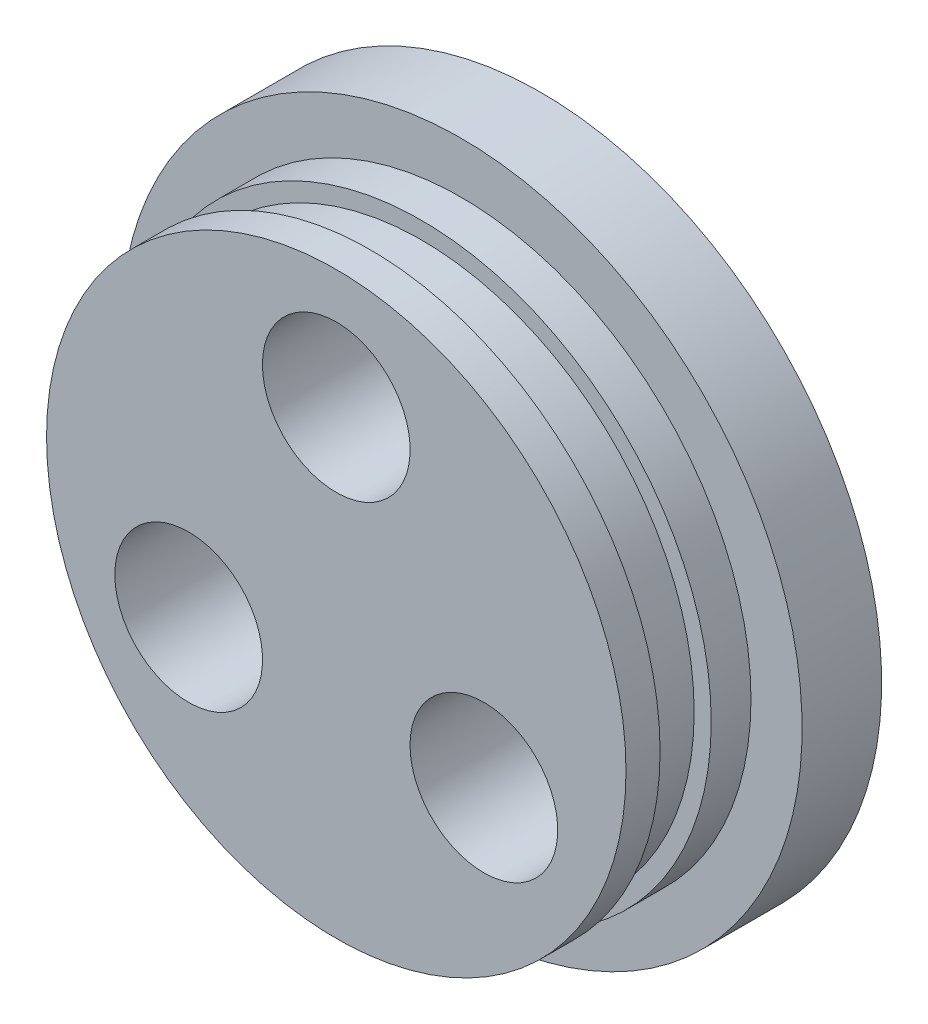
ISO-10303-21;
HEADER;
FILE_DESCRIPTION(('STEP AP214'),'2;1');
FILE_NAME('part.step','',(''),(''),'','','');
FILE_SCHEMA(('AUTOMOTIVE_DESIGN { 1 0 10303 214 1 1 1 1 }'));
ENDSEC;
DATA;
#1=APPLICATION_CONTEXT('core data for automotive mechanical design processes');
#2=APPLICATION_PROTOCOL_DEFINITION('international standard','automotive_design',2000,#1);
#3=PRODUCT_CONTEXT('',#1,'mechanical');
#4=PRODUCT('Part','Part','',(#3));
#5=PRODUCT_RELATED_PRODUCT_CATEGORY('part','',(#4));
#6=PRODUCT_DEFINITION_FORMATION('','',#4);
#7=PRODUCT_DEFINITION_CONTEXT('part definition',#1,'design');
#8=PRODUCT_DEFINITION('design','',#6,#7);
#9=PRODUCT_DEFINITION_SHAPE('','',#8);
#10=(LENGTH_UNIT() NAMED_UNIT(*) SI_UNIT(.MILLI.,.METRE.));
#11=(NAMED_UNIT(*) PLANE_ANGLE_UNIT() SI_UNIT($,.RADIAN.));
#12=(NAMED_UNIT(*) SI_UNIT($,.STERADIAN.) SOLID_ANGLE_UNIT());
#13=UNCERTAINTY_MEASURE_WITH_UNIT(LENGTH_MEASURE(1.E-05),#10,'distance_accuracy_value','');
#14=(GEOMETRIC_REPRESENTATION_CONTEXT(3) GLOBAL_UNCERTAINTY_ASSIGNED_CONTEXT((#13)) GLOBAL_UNIT_ASSIGNED_CONTEXT((#10,
#11,#12)) REPRESENTATION_CONTEXT('',''));
#15=CARTESIAN_POINT('',(0.,0.,0.));
#16=DIRECTION('',(0.,0.,1.));
#17=DIRECTION('',(1.,0.,0.));
#18=AXIS2_PLACEMENT_3D('',#15,#16,#17);
#19=CARTESIAN_POINT('',(0.,0.,11.));
#20=DIRECTION('',(0.,0.,-1.));
#21=DIRECTION('',(-1.,0.,0.));
#22=AXIS2_PLACEMENT_3D('',#19,#20,#21);
#23=CYLINDRICAL_SURFACE('',#22,25.5);
#24=CARTESIAN_POINT('',(0.,0.,0.));
#25=DIRECTION('',(0.,0.,1.));
#26=DIRECTION('',(1.,0.,0.));
#27=AXIS2_PLACEMENT_3D('',#24,#25,#26);
#28=CIRCLE('',#27,25.5);
#29=CARTESIAN_POINT('',(25.5,0.,0.));
#30=VERTEX_POINT('',#29);
#31=EDGE_CURVE('E52',#30,#30,#28,.T.);
#32=ORIENTED_EDGE('',*,*,#31,.T.);
#33=EDGE_LOOP('',(#32));
#34=FACE_BOUND('',#33,.T.);
#35=CARTESIAN_POINT('',(0.,0.,3.5));
#36=DIRECTION('',(0.,0.,1.));
#37=DIRECTION('',(1.,0.,0.));
#38=AXIS2_PLACEMENT_3D('',#35,#36,#37);
#39=CIRCLE('',#38,25.5);
#40=CARTESIAN_POINT('',(25.5,0.,3.5));
#41=VERTEX_POINT('',#40);
#42=EDGE_CURVE('E68',#41,#41,#39,.T.);
#43=ORIENTED_EDGE('',*,*,#42,.F.);
#44=EDGE_LOOP('',(#43));
#45=FACE_BOUND('',#44,.T.);
#46=ADVANCED_FACE('F43',(#34,#45),#23,.T.);
#47=CARTESIAN_POINT('',(0.,0.,-7.));
#48=DIRECTION('',(0.,0.,1.));
#49=DIRECTION('',(1.,0.,0.));
#50=AXIS2_PLACEMENT_3D('',#47,#48,#49);
#51=CYLINDRICAL_SURFACE('',#50,30.);
#52=CARTESIAN_POINT('',(0.,0.,-7.));
#53=DIRECTION('',(0.,0.,-1.));
#54=DIRECTION('',(-1.,0.,0.));
#55=AXIS2_PLACEMENT_3D('',#52,#53,#54);
#56=CIRCLE('',#55,30.);
#57=CARTESIAN_POINT('',(-30.,0.,-7.));
#58=VERTEX_POINT('',#57);
#59=EDGE_CURVE('E58',#58,#58,#56,.T.);
#60=ORIENTED_EDGE('',*,*,#59,.F.);
#61=EDGE_LOOP('',(#60));
#62=FACE_BOUND('',#61,.T.);
#63=CARTESIAN_POINT('',(0.,0.,0.));
#64=DIRECTION('',(0.,0.,-1.));
#65=DIRECTION('',(-1.,0.,0.));
#66=AXIS2_PLACEMENT_3D('',#63,#64,#65);
#67=CIRCLE('',#66,30.);
#68=CARTESIAN_POINT('',(-30.,0.,0.));
#69=VERTEX_POINT('',#68);
#70=EDGE_CURVE('E61',#69,#69,#67,.T.);
#71=ORIENTED_EDGE('',*,*,#70,.T.);
#72=EDGE_LOOP('',(#71));
#73=FACE_BOUND('',#72,.T.);
#74=ADVANCED_FACE('F104',(#62,#73),#51,.T.);
#75=CARTESIAN_POINT('',(0.,0.,-7.));
#76=DIRECTION('',(0.,0.,-1.));
#77=DIRECTION('',(-1.,0.,0.));
#78=AXIS2_PLACEMENT_3D('',#75,#76,#77);
#79=PLANE('',#78);
#80=CARTESIAN_POINT('',(0.,15.,-7.));
#81=DIRECTION('',(0.,0.,-1.));
#82=DIRECTION('',(-1.,0.,0.));
#83=AXIS2_PLACEMENT_3D('',#80,#81,#82);
#84=CIRCLE('',#83,6.5);
#85=CARTESIAN_POINT('',(-6.5,15.,-7.));
#86=VERTEX_POINT('',#85);
#87=EDGE_CURVE('E77',#86,#86,#84,.T.);
#88=ORIENTED_EDGE('',*,*,#87,.F.);
#89=EDGE_LOOP('',(#88));
#90=FACE_BOUND('',#89,.T.);
#91=CARTESIAN_POINT('',(12.9903810567665,-7.50000000000006,-7.));
#92=DIRECTION('',(0.,0.,-1.));
#93=DIRECTION('',(-1.,0.,0.));
#94=AXIS2_PLACEMENT_3D('',#91,#92,#93);
#95=CIRCLE('',#94,6.5);
#96=CARTESIAN_POINT('',(6.49038105676654,-7.50000000000006,-7.));
#97=VERTEX_POINT('',#96);
#98=EDGE_CURVE('E164',#97,#97,#95,.T.);
#99=ORIENTED_EDGE('',*,*,#98,.F.);
#100=EDGE_LOOP('',(#99));
#101=FACE_BOUND('',#100,.T.);
#102=CARTESIAN_POINT('',(-12.9903810567666,-7.49999999999988,-7.));
#103=DIRECTION('',(0.,0.,-1.));
#104=DIRECTION('',(-1.,0.,0.));
#105=AXIS2_PLACEMENT_3D('',#102,#103,#104);
#106=CIRCLE('',#105,6.5);
#107=CARTESIAN_POINT('',(-19.4903810567666,-7.49999999999988,-7.));
#108=VERTEX_POINT('',#107);
#109=EDGE_CURVE('E168',#108,#108,#106,.T.);
#110=ORIENTED_EDGE('',*,*,#109,.F.);
#111=EDGE_LOOP('',(#110));
#112=FACE_BOUND('',#111,.T.);
#113=ORIENTED_EDGE('',*,*,#59,.T.);
#114=EDGE_LOOP('',(#113));
#115=FACE_BOUND('',#114,.T.);
#116=ADVANCED_FACE('F109',(#90,#101,#112,#115),#79,.T.);
#117=CARTESIAN_POINT('',(0.,0.,0.));
#118=DIRECTION('',(0.,0.,-1.));
#119=DIRECTION('',(-1.,0.,0.));
#120=AXIS2_PLACEMENT_3D('',#117,#118,#119);
#121=PLANE('',#120);
#122=ORIENTED_EDGE('',*,*,#31,.F.);
#123=EDGE_LOOP('',(#122));
#124=FACE_BOUND('',#123,.T.);
#125=ORIENTED_EDGE('',*,*,#70,.F.);
#126=EDGE_LOOP('',(#125));
#127=FACE_BOUND('',#126,.T.);
#128=ADVANCED_FACE('F106',(#124,#127),#121,.F.);
#129=CARTESIAN_POINT('',(0.,0.,3.5));
#130=DIRECTION('',(0.,0.,1.));
#131=DIRECTION('',(1.,0.,0.));
#132=AXIS2_PLACEMENT_3D('',#129,#130,#131);
#133=PLANE('',#132);
#134=CARTESIAN_POINT('',(0.,0.,3.5));
#135=DIRECTION('',(0.,0.,1.));
#136=DIRECTION('',(1.,0.,0.));
#137=AXIS2_PLACEMENT_3D('',#134,#135,#136);
#138=CIRCLE('',#137,24.);
#139=CARTESIAN_POINT('',(24.,0.,3.5));
#140=VERTEX_POINT('',#139);
#141=EDGE_CURVE('E69',#140,#140,#138,.T.);
#142=ORIENTED_EDGE('',*,*,#141,.F.);
#143=EDGE_LOOP('',(#142));
#144=FACE_BOUND('',#143,.T.);
#145=ORIENTED_EDGE('',*,*,#42,.T.);
#146=EDGE_LOOP('',(#145));
#147=FACE_BOUND('',#146,.T.);
#148=ADVANCED_FACE('F108',(#144,#147),#133,.T.);
#149=CARTESIAN_POINT('',(0.,0.,8.));
#150=DIRECTION('',(0.,0.,1.));
#151=DIRECTION('',(1.,0.,0.));
#152=AXIS2_PLACEMENT_3D('',#149,#150,#151);
#153=PLANE('',#152);
#154=CARTESIAN_POINT('',(0.,0.,8.));
#155=DIRECTION('',(0.,0.,1.));
#156=DIRECTION('',(1.,0.,0.));
#157=AXIS2_PLACEMENT_3D('',#154,#155,#156);
#158=CIRCLE('',#157,24.);
#159=CARTESIAN_POINT('',(24.,0.,8.));
#160=VERTEX_POINT('',#159);
#161=EDGE_CURVE('E84',#160,#160,#158,.T.);
#162=ORIENTED_EDGE('',*,*,#161,.T.);
#163=EDGE_LOOP('',(#162));
#164=FACE_BOUND('',#163,.T.);
#165=CARTESIAN_POINT('',(0.,0.,8.));
#166=DIRECTION('',(0.,0.,1.));
#167=DIRECTION('',(1.,0.,0.));
#168=AXIS2_PLACEMENT_3D('',#165,#166,#167);
#169=CIRCLE('',#168,25.5);
#170=CARTESIAN_POINT('',(25.5,0.,8.));
#171=VERTEX_POINT('',#170);
#172=EDGE_CURVE('E64',#171,#171,#169,.T.);
#173=ORIENTED_EDGE('',*,*,#172,.F.);
#174=EDGE_LOOP('',(#173));
#175=FACE_BOUND('',#174,.T.);
#176=ADVANCED_FACE('F117',(#164,#175),#153,.F.);
#177=CARTESIAN_POINT('',(0.,0.,3.5));
#178=DIRECTION('',(0.,0.,1.));
#179=DIRECTION('',(1.,0.,0.));
#180=AXIS2_PLACEMENT_3D('',#177,#178,#179);
#181=CYLINDRICAL_SURFACE('',#180,24.);
#182=ORIENTED_EDGE('',*,*,#141,.T.);
#183=EDGE_LOOP('',(#182));
#184=FACE_BOUND('',#183,.T.);
#185=ORIENTED_EDGE('',*,*,#161,.F.);
#186=EDGE_LOOP('',(#185));
#187=FACE_BOUND('',#186,.T.);
#188=ADVANCED_FACE('F142',(#184,#187),#181,.T.);
#189=CARTESIAN_POINT('',(0.,0.,11.));
#190=DIRECTION('',(0.,0.,1.));
#191=DIRECTION('',(1.,0.,0.));
#192=AXIS2_PLACEMENT_3D('',#189,#190,#191);
#193=PLANE('',#192);
#194=CARTESIAN_POINT('',(0.,15.,11.));
#195=DIRECTION('',(0.,0.,1.));
#196=DIRECTION('',(1.,0.,0.));
#197=AXIS2_PLACEMENT_3D('',#194,#195,#196);
#198=CIRCLE('',#197,6.5);
#199=CARTESIAN_POINT('',(-6.5,15.,11.));
#200=VERTEX_POINT('',#199);
#201=EDGE_CURVE('E47',#200,#200,#198,.T.);
#202=ORIENTED_EDGE('',*,*,#201,.F.);
#203=EDGE_LOOP('',(#202));
#204=FACE_BOUND('',#203,.T.);
#205=CARTESIAN_POINT('',(12.9903810567665,-7.50000000000006,11.));
#206=DIRECTION('',(0.,0.,1.));
#207=DIRECTION('',(1.,0.,0.));
#208=AXIS2_PLACEMENT_3D('',#205,#206,#207);
#209=CIRCLE('',#208,6.5);
#210=CARTESIAN_POINT('',(6.49038105676654,-7.50000000000006,11.));
#211=VERTEX_POINT('',#210);
#212=EDGE_CURVE('E76',#211,#211,#209,.T.);
#213=ORIENTED_EDGE('',*,*,#212,.F.);
#214=EDGE_LOOP('',(#213));
#215=FACE_BOUND('',#214,.T.);
#216=CARTESIAN_POINT('',(-12.9903810567666,-7.49999999999988,11.));
#217=DIRECTION('',(0.,0.,1.));
#218=DIRECTION('',(1.,0.,0.));
#219=AXIS2_PLACEMENT_3D('',#216,#217,#218);
#220=CIRCLE('',#219,6.5);
#221=CARTESIAN_POINT('',(-19.4903810567666,-7.49999999999988,11.));
#222=VERTEX_POINT('',#221);
#223=EDGE_CURVE('E73',#222,#222,#220,.T.);
#224=ORIENTED_EDGE('',*,*,#223,.F.);
#225=EDGE_LOOP('',(#224));
#226=FACE_BOUND('',#225,.T.);
#227=CARTESIAN_POINT('',(0.,0.,11.));
#228=DIRECTION('',(0.,0.,1.));
#229=DIRECTION('',(1.,0.,0.));
#230=AXIS2_PLACEMENT_3D('',#227,#228,#229);
#231=CIRCLE('',#230,25.5);
#232=CARTESIAN_POINT('',(25.5,0.,11.));
#233=VERTEX_POINT('',#232);
#234=EDGE_CURVE('E10',#233,#233,#231,.T.);
#235=ORIENTED_EDGE('',*,*,#234,.T.);
#236=EDGE_LOOP('',(#235));
#237=FACE_BOUND('',#236,.T.);
#238=ADVANCED_FACE('F132',(#204,#215,#226,#237),#193,.T.);
#239=ORIENTED_EDGE('',*,*,#172,.T.);
#240=EDGE_LOOP('',(#239));
#241=FACE_BOUND('',#240,.T.);
#242=ORIENTED_EDGE('',*,*,#234,.F.);
#243=EDGE_LOOP('',(#242));
#244=FACE_BOUND('',#243,.T.);
#245=ADVANCED_FACE('F45',(#241,#244),#23,.T.);
#246=CARTESIAN_POINT('',(-12.9903810567666,-7.49999999999988,23.5));
#247=DIRECTION('',(0.,0.,-1.));
#248=DIRECTION('',(-1.,0.,0.));
#249=AXIS2_PLACEMENT_3D('',#246,#247,#248);
#250=CYLINDRICAL_SURFACE('',#249,6.5);
#251=CARTESIAN_POINT('',(-19.4903810567666,-7.49999999999988,11.));
#252=CARTESIAN_POINT('',(-19.4903810567666,-7.49999999999988,10.8125));
#253=CARTESIAN_POINT('',(-19.4903810567666,-7.49999999999988,10.625));
#254=CARTESIAN_POINT('',(-19.4903810567666,-7.49999999999988,10.25));
#255=CARTESIAN_POINT('',(-19.4903810567666,-7.49999999999988,10.0625));
#256=CARTESIAN_POINT('',(-19.4903810567666,-7.49999999999988,9.6875));
#257=CARTESIAN_POINT('',(-19.4903810567666,-7.49999999999988,9.5));
#258=CARTESIAN_POINT('',(-19.4903810567666,-7.49999999999988,9.125));
#259=CARTESIAN_POINT('',(-19.4903810567666,-7.49999999999988,8.9375));
#260=CARTESIAN_POINT('',(-19.4903810567666,-7.49999999999988,8.5625));
#261=CARTESIAN_POINT('',(-19.4903810567666,-7.49999999999988,8.375));
#262=CARTESIAN_POINT('',(-19.4903810567666,-7.49999999999988,8.));
#263=CARTESIAN_POINT('',(-19.4903810567666,-7.49999999999988,7.8125));
#264=CARTESIAN_POINT('',(-19.4903810567666,-7.49999999999988,7.4375));
#265=CARTESIAN_POINT('',(-19.4903810567666,-7.49999999999988,7.25));
#266=CARTESIAN_POINT('',(-19.4903810567666,-7.49999999999988,6.875));
#267=CARTESIAN_POINT('',(-19.4903810567666,-7.49999999999988,6.6875));
#268=CARTESIAN_POINT('',(-19.4903810567666,-7.49999999999988,6.3125));
#269=CARTESIAN_POINT('',(-19.4903810567666,-7.49999999999988,6.125));
#270=CARTESIAN_POINT('',(-19.4903810567666,-7.49999999999988,5.75));
#271=CARTESIAN_POINT('',(-19.4903810567666,-7.49999999999988,5.5625));
#272=CARTESIAN_POINT('',(-19.4903810567666,-7.49999999999988,5.1875));
#273=CARTESIAN_POINT('',(-19.4903810567666,-7.49999999999988,5.));
#274=CARTESIAN_POINT('',(-19.4903810567666,-7.49999999999988,4.625));
#275=CARTESIAN_POINT('',(-19.4903810567666,-7.49999999999988,4.4375));
#276=CARTESIAN_POINT('',(-19.4903810567666,-7.49999999999988,4.0625));
#277=CARTESIAN_POINT('',(-19.4903810567666,-7.49999999999988,3.875));
#278=CARTESIAN_POINT('',(-19.4903810567666,-7.49999999999988,3.5));
#279=CARTESIAN_POINT('',(-19.4903810567666,-7.49999999999988,3.3125));
#280=CARTESIAN_POINT('',(-19.4903810567666,-7.49999999999988,2.9375));
#281=CARTESIAN_POINT('',(-19.4903810567666,-7.49999999999988,2.75));
#282=CARTESIAN_POINT('',(-19.4903810567666,-7.49999999999988,2.375));
#283=CARTESIAN_POINT('',(-19.4903810567666,-7.49999999999988,2.1875));
#284=CARTESIAN_POINT('',(-19.4903810567666,-7.49999999999988,1.8125));
#285=CARTESIAN_POINT('',(-19.4903810567666,-7.49999999999988,1.625));
#286=CARTESIAN_POINT('',(-19.4903810567666,-7.49999999999988,1.25));
#287=CARTESIAN_POINT('',(-19.4903810567666,-7.49999999999988,1.0625));
#288=CARTESIAN_POINT('',(-19.4903810567666,-7.49999999999988,0.687499999999997));
#289=CARTESIAN_POINT('',(-19.4903810567666,-7.49999999999988,0.499999999999997));
#290=CARTESIAN_POINT('',(-19.4903810567666,-7.49999999999988,0.124999999999997));
#291=CARTESIAN_POINT('',(-19.4903810567666,-7.49999999999988,-0.0625000000000036));
#292=CARTESIAN_POINT('',(-19.4903810567666,-7.49999999999988,-0.437500000000004));
#293=CARTESIAN_POINT('',(-19.4903810567666,-7.49999999999988,-0.625000000000004));
#294=CARTESIAN_POINT('',(-19.4903810567666,-7.49999999999988,-1.));
#295=CARTESIAN_POINT('',(-19.4903810567666,-7.49999999999988,-1.1875));
#296=CARTESIAN_POINT('',(-19.4903810567666,-7.49999999999988,-1.5625));
#297=CARTESIAN_POINT('',(-19.4903810567666,-7.49999999999988,-1.75));
#298=CARTESIAN_POINT('',(-19.4903810567666,-7.49999999999988,-2.125));
#299=CARTESIAN_POINT('',(-19.4903810567666,-7.49999999999988,-2.3125));
#300=CARTESIAN_POINT('',(-19.4903810567666,-7.49999999999988,-2.6875));
#301=CARTESIAN_POINT('',(-19.4903810567666,-7.49999999999988,-2.875));
#302=CARTESIAN_POINT('',(-19.4903810567666,-7.49999999999988,-3.25));
#303=CARTESIAN_POINT('',(-19.4903810567666,-7.49999999999988,-3.4375));
#304=CARTESIAN_POINT('',(-19.4903810567666,-7.49999999999988,-3.8125));
#305=CARTESIAN_POINT('',(-19.4903810567666,-7.49999999999988,-4.));
#306=CARTESIAN_POINT('',(-19.4903810567666,-7.49999999999988,-4.375));
#307=CARTESIAN_POINT('',(-19.4903810567666,-7.49999999999988,-4.5625));
#308=CARTESIAN_POINT('',(-19.4903810567666,-7.49999999999988,-4.9375));
#309=CARTESIAN_POINT('',(-19.4903810567666,-7.49999999999988,-5.125));
#310=CARTESIAN_POINT('',(-19.4903810567666,-7.49999999999988,-5.5));
#311=CARTESIAN_POINT('',(-19.4903810567666,-7.49999999999988,-5.6875));
#312=CARTESIAN_POINT('',(-19.4903810567666,-7.49999999999988,-6.0625));
#313=CARTESIAN_POINT('',(-19.4903810567666,-7.49999999999988,-6.25));
#314=CARTESIAN_POINT('',(-19.4903810567666,-7.49999999999988,-6.625));
#315=CARTESIAN_POINT('',(-19.4903810567666,-7.49999999999988,-6.8125));
#316=CARTESIAN_POINT('',(-19.4903810567666,-7.49999999999988,-7.));
#317=B_SPLINE_CURVE_WITH_KNOTS('',3,(#251,#252,#253,#254,#255,#256,#257,#258,#259,#260,#261,
#262,#263,#264,#265,#266,#267,#268,#269,#270,#271,#272,#273,#274,#275,#276,#277,#278,#279,#280,
#281,#282,#283,#284,#285,#286,#287,#288,#289,#290,#291,#292,#293,#294,#295,#296,#297,#298,#299,
#300,#301,#302,#303,#304,#305,#306,#307,#308,#309,#310,#311,#312,#313,#314,#315,#316),
.UNSPECIFIED.,.F.,.F.,(4,2,2,2,2,2,2,2,2,2,2,2,2,2,2,2,2,2,2,2,2,2,2,2,2,2,2,2,2,2,2,2,4),(0.,
0.5625,1.125,1.6875,2.25,2.8125,3.375,3.9375,4.5,5.0625,5.625,6.1875,6.75,7.3125,7.875,8.4375,
9.,9.5625,10.125,10.6875,11.25,11.8125,12.375,12.9375,13.5,14.0625,14.625,15.1875,15.75,16.3125,
16.875,17.4375,18.),.UNSPECIFIED.);
#318=EDGE_CURVE('BSEAM131',#222,#108,#317,.T.);
#319=ORIENTED_EDGE('',*,*,#223,.T.);
#320=ORIENTED_EDGE('',*,*,#109,.T.);
#321=ORIENTED_EDGE('',*,*,#318,.T.);
#322=ORIENTED_EDGE('',*,*,#318,.F.);
#323=EDGE_LOOP('',(#319,#321,#320,#322));
#324=FACE_BOUND('',#323,.T.);
#325=ADVANCED_FACE('F131',(#324),#250,.F.);
#326=CARTESIAN_POINT('',(12.9903810567665,-7.50000000000006,23.5));
#327=DIRECTION('',(0.,0.,-1.));
#328=DIRECTION('',(-1.,0.,0.));
#329=AXIS2_PLACEMENT_3D('',#326,#327,#328);
#330=CYLINDRICAL_SURFACE('',#329,6.5);
#331=CARTESIAN_POINT('',(6.49038105676654,-7.50000000000006,11.));
#332=CARTESIAN_POINT('',(6.49038105676654,-7.50000000000006,10.8125));
#333=CARTESIAN_POINT('',(6.49038105676654,-7.50000000000006,10.625));
#334=CARTESIAN_POINT('',(6.49038105676654,-7.50000000000006,10.25));
#335=CARTESIAN_POINT('',(6.49038105676654,-7.50000000000006,10.0625));
#336=CARTESIAN_POINT('',(6.49038105676654,-7.50000000000006,9.6875));
#337=CARTESIAN_POINT('',(6.49038105676654,-7.50000000000006,9.5));
#338=CARTESIAN_POINT('',(6.49038105676654,-7.50000000000006,9.125));
#339=CARTESIAN_POINT('',(6.49038105676654,-7.50000000000006,8.9375));
#340=CARTESIAN_POINT('',(6.49038105676654,-7.50000000000006,8.5625));
#341=CARTESIAN_POINT('',(6.49038105676654,-7.50000000000006,8.375));
#342=CARTESIAN_POINT('',(6.49038105676654,-7.50000000000006,8.));
#343=CARTESIAN_POINT('',(6.49038105676654,-7.50000000000006,7.8125));
#344=CARTESIAN_POINT('',(6.49038105676654,-7.50000000000006,7.4375));
#345=CARTESIAN_POINT('',(6.49038105676654,-7.50000000000006,7.25));
#346=CARTESIAN_POINT('',(6.49038105676654,-7.50000000000006,6.875));
#347=CARTESIAN_POINT('',(6.49038105676654,-7.50000000000006,6.6875));
#348=CARTESIAN_POINT('',(6.49038105676654,-7.50000000000006,6.3125));
#349=CARTESIAN_POINT('',(6.49038105676654,-7.50000000000006,6.125));
#350=CARTESIAN_POINT('',(6.49038105676654,-7.50000000000006,5.75));
#351=CARTESIAN_POINT('',(6.49038105676654,-7.50000000000006,5.5625));
#352=CARTESIAN_POINT('',(6.49038105676654,-7.50000000000006,5.1875));
#353=CARTESIAN_POINT('',(6.49038105676654,-7.50000000000006,5.));
#354=CARTESIAN_POINT('',(6.49038105676654,-7.50000000000006,4.625));
#355=CARTESIAN_POINT('',(6.49038105676654,-7.50000000000006,4.4375));
#356=CARTESIAN_POINT('',(6.49038105676654,-7.50000000000006,4.0625));
#357=CARTESIAN_POINT('',(6.49038105676654,-7.50000000000006,3.875));
#358=CARTESIAN_POINT('',(6.49038105676654,-7.50000000000006,3.5));
#359=CARTESIAN_POINT('',(6.49038105676654,-7.50000000000006,3.3125));
#360=CARTESIAN_POINT('',(6.49038105676654,-7.50000000000006,2.9375));
#361=CARTESIAN_POINT('',(6.49038105676654,-7.50000000000006,2.75));
#362=CARTESIAN_POINT('',(6.49038105676654,-7.50000000000006,2.375));
#363=CARTESIAN_POINT('',(6.49038105676654,-7.50000000000006,2.1875));
#364=CARTESIAN_POINT('',(6.49038105676654,-7.50000000000006,1.8125));
#365=CARTESIAN_POINT('',(6.49038105676654,-7.50000000000006,1.625));
#366=CARTESIAN_POINT('',(6.49038105676654,-7.50000000000006,1.25));
#367=CARTESIAN_POINT('',(6.49038105676654,-7.50000000000006,1.0625));
#368=CARTESIAN_POINT('',(6.49038105676654,-7.50000000000006,0.687499999999997));
#369=CARTESIAN_POINT('',(6.49038105676654,-7.50000000000006,0.499999999999997));
#370=CARTESIAN_POINT('',(6.49038105676654,-7.50000000000006,0.124999999999997));
#371=CARTESIAN_POINT('',(6.49038105676654,-7.50000000000006,-0.0625000000000036));
#372=CARTESIAN_POINT('',(6.49038105676654,-7.50000000000006,-0.437500000000004));
#373=CARTESIAN_POINT('',(6.49038105676654,-7.50000000000006,-0.625000000000004));
#374=CARTESIAN_POINT('',(6.49038105676654,-7.50000000000006,-1.));
#375=CARTESIAN_POINT('',(6.49038105676654,-7.50000000000006,-1.1875));
#376=CARTESIAN_POINT('',(6.49038105676654,-7.50000000000006,-1.5625));
#377=CARTESIAN_POINT('',(6.49038105676654,-7.50000000000006,-1.75));
#378=CARTESIAN_POINT('',(6.49038105676654,-7.50000000000006,-2.125));
#379=CARTESIAN_POINT('',(6.49038105676654,-7.50000000000006,-2.3125));
#380=CARTESIAN_POINT('',(6.49038105676654,-7.50000000000006,-2.6875));
#381=CARTESIAN_POINT('',(6.49038105676654,-7.50000000000006,-2.875));
#382=CARTESIAN_POINT('',(6.49038105676654,-7.50000000000006,-3.25));
#383=CARTESIAN_POINT('',(6.49038105676654,-7.50000000000006,-3.4375));
#384=CARTESIAN_POINT('',(6.49038105676654,-7.50000000000006,-3.8125));
#385=CARTESIAN_POINT('',(6.49038105676654,-7.50000000000006,-4.));
#386=CARTESIAN_POINT('',(6.49038105676654,-7.50000000000006,-4.375));
#387=CARTESIAN_POINT('',(6.49038105676654,-7.50000000000006,-4.5625));
#388=CARTESIAN_POINT('',(6.49038105676654,-7.50000000000006,-4.9375));
#389=CARTESIAN_POINT('',(6.49038105676654,-7.50000000000006,-5.125));
#390=CARTESIAN_POINT('',(6.49038105676654,-7.50000000000006,-5.5));
#391=CARTESIAN_POINT('',(6.49038105676654,-7.50000000000006,-5.6875));
#392=CARTESIAN_POINT('',(6.49038105676654,-7.50000000000006,-6.0625));
#393=CARTESIAN_POINT('',(6.49038105676654,-7.50000000000006,-6.25));
#394=CARTESIAN_POINT('',(6.49038105676654,-7.50000000000006,-6.625));
#395=CARTESIAN_POINT('',(6.49038105676654,-7.50000000000006,-6.8125));
#396=CARTESIAN_POINT('',(6.49038105676654,-7.50000000000006,-7.));
#397=B_SPLINE_CURVE_WITH_KNOTS('',3,(#331,#332,#333,#334,#335,#336,#337,#338,#339,#340,#341,
#342,#343,#344,#345,#346,#347,#348,#349,#350,#351,#352,#353,#354,#355,#356,#357,#358,#359,#360,
#361,#362,#363,#364,#365,#366,#367,#368,#369,#370,#371,#372,#373,#374,#375,#376,#377,#378,#379,
#380,#381,#382,#383,#384,#385,#386,#387,#388,#389,#390,#391,#392,#393,#394,#395,#396),
.UNSPECIFIED.,.F.,.F.,(4,2,2,2,2,2,2,2,2,2,2,2,2,2,2,2,2,2,2,2,2,2,2,2,2,2,2,2,2,2,2,2,4),(0.,
0.5625,1.125,1.6875,2.25,2.8125,3.375,3.9375,4.5,5.0625,5.625,6.1875,6.75,7.3125,7.875,8.4375,
9.,9.5625,10.125,10.6875,11.25,11.8125,12.375,12.9375,13.5,14.0625,14.625,15.1875,15.75,16.3125,
16.875,17.4375,18.),.UNSPECIFIED.);
#398=EDGE_CURVE('BSEAM138',#211,#97,#397,.T.);
#399=ORIENTED_EDGE('',*,*,#212,.T.);
#400=ORIENTED_EDGE('',*,*,#98,.T.);
#401=ORIENTED_EDGE('',*,*,#398,.T.);
#402=ORIENTED_EDGE('',*,*,#398,.F.);
#403=EDGE_LOOP('',(#399,#401,#400,#402));
#404=FACE_BOUND('',#403,.T.);
#405=ADVANCED_FACE('F138',(#404),#330,.F.);
#406=CARTESIAN_POINT('',(0.,15.,23.5));
#407=DIRECTION('',(0.,0.,-1.));
#408=DIRECTION('',(-1.,0.,0.));
#409=AXIS2_PLACEMENT_3D('',#406,#407,#408);
#410=CYLINDRICAL_SURFACE('',#409,6.5);
#411=CARTESIAN_POINT('',(-6.5,15.,11.));
#412=CARTESIAN_POINT('',(-6.5,15.,10.8125));
#413=CARTESIAN_POINT('',(-6.5,15.,10.625));
#414=CARTESIAN_POINT('',(-6.5,15.,10.25));
#415=CARTESIAN_POINT('',(-6.5,15.,10.0625));
#416=CARTESIAN_POINT('',(-6.5,15.,9.6875));
#417=CARTESIAN_POINT('',(-6.5,15.,9.5));
#418=CARTESIAN_POINT('',(-6.5,15.,9.125));
#419=CARTESIAN_POINT('',(-6.5,15.,8.9375));
#420=CARTESIAN_POINT('',(-6.5,15.,8.5625));
#421=CARTESIAN_POINT('',(-6.5,15.,8.375));
#422=CARTESIAN_POINT('',(-6.5,15.,8.));
#423=CARTESIAN_POINT('',(-6.5,15.,7.8125));
#424=CARTESIAN_POINT('',(-6.5,15.,7.4375));
#425=CARTESIAN_POINT('',(-6.5,15.,7.25));
#426=CARTESIAN_POINT('',(-6.5,15.,6.875));
#427=CARTESIAN_POINT('',(-6.5,15.,6.6875));
#428=CARTESIAN_POINT('',(-6.5,15.,6.3125));
#429=CARTESIAN_POINT('',(-6.5,15.,6.125));
#430=CARTESIAN_POINT('',(-6.5,15.,5.75));
#431=CARTESIAN_POINT('',(-6.5,15.,5.5625));
#432=CARTESIAN_POINT('',(-6.5,15.,5.1875));
#433=CARTESIAN_POINT('',(-6.5,15.,5.));
#434=CARTESIAN_POINT('',(-6.5,15.,4.625));
#435=CARTESIAN_POINT('',(-6.5,15.,4.4375));
#436=CARTESIAN_POINT('',(-6.5,15.,4.0625));
#437=CARTESIAN_POINT('',(-6.5,15.,3.875));
#438=CARTESIAN_POINT('',(-6.5,15.,3.5));
#439=CARTESIAN_POINT('',(-6.5,15.,3.3125));
#440=CARTESIAN_POINT('',(-6.5,15.,2.9375));
#441=CARTESIAN_POINT('',(-6.5,15.,2.75));
#442=CARTESIAN_POINT('',(-6.5,15.,2.375));
#443=CARTESIAN_POINT('',(-6.5,15.,2.1875));
#444=CARTESIAN_POINT('',(-6.5,15.,1.8125));
#445=CARTESIAN_POINT('',(-6.5,15.,1.625));
#446=CARTESIAN_POINT('',(-6.5,15.,1.25));
#447=CARTESIAN_POINT('',(-6.5,15.,1.0625));
#448=CARTESIAN_POINT('',(-6.5,15.,0.687499999999997));
#449=CARTESIAN_POINT('',(-6.5,15.,0.499999999999997));
#450=CARTESIAN_POINT('',(-6.5,15.,0.124999999999997));
#451=CARTESIAN_POINT('',(-6.5,15.,-0.0625000000000036));
#452=CARTESIAN_POINT('',(-6.5,15.,-0.437500000000004));
#453=CARTESIAN_POINT('',(-6.5,15.,-0.625000000000004));
#454=CARTESIAN_POINT('',(-6.5,15.,-1.));
#455=CARTESIAN_POINT('',(-6.5,15.,-1.1875));
#456=CARTESIAN_POINT('',(-6.5,15.,-1.5625));
#457=CARTESIAN_POINT('',(-6.5,15.,-1.75));
#458=CARTESIAN_POINT('',(-6.5,15.,-2.125));
#459=CARTESIAN_POINT('',(-6.5,15.,-2.3125));
#460=CARTESIAN_POINT('',(-6.5,15.,-2.6875));
#461=CARTESIAN_POINT('',(-6.5,15.,-2.875));
#462=CARTESIAN_POINT('',(-6.5,15.,-3.25));
#463=CARTESIAN_POINT('',(-6.5,15.,-3.4375));
#464=CARTESIAN_POINT('',(-6.5,15.,-3.8125));
#465=CARTESIAN_POINT('',(-6.5,15.,-4.));
#466=CARTESIAN_POINT('',(-6.5,15.,-4.375));
#467=CARTESIAN_POINT('',(-6.5,15.,-4.5625));
#468=CARTESIAN_POINT('',(-6.5,15.,-4.9375));
#469=CARTESIAN_POINT('',(-6.5,15.,-5.125));
#470=CARTESIAN_POINT('',(-6.5,15.,-5.5));
#471=CARTESIAN_POINT('',(-6.5,15.,-5.6875));
#472=CARTESIAN_POINT('',(-6.5,15.,-6.0625));
#473=CARTESIAN_POINT('',(-6.5,15.,-6.25));
#474=CARTESIAN_POINT('',(-6.5,15.,-6.625));
#475=CARTESIAN_POINT('',(-6.5,15.,-6.8125));
#476=CARTESIAN_POINT('',(-6.5,15.,-7.));
#477=B_SPLINE_CURVE_WITH_KNOTS('',3,(#411,#412,#413,#414,#415,#416,#417,#418,#419,#420,#421,
#422,#423,#424,#425,#426,#427,#428,#429,#430,#431,#432,#433,#434,#435,#436,#437,#438,#439,#440,
#441,#442,#443,#444,#445,#446,#447,#448,#449,#450,#451,#452,#453,#454,#455,#456,#457,#458,#459,
#460,#461,#462,#463,#464,#465,#466,#467,#468,#469,#470,#471,#472,#473,#474,#475,#476),
.UNSPECIFIED.,.F.,.F.,(4,2,2,2,2,2,2,2,2,2,2,2,2,2,2,2,2,2,2,2,2,2,2,2,2,2,2,2,2,2,2,2,4),(0.,
0.5625,1.125,1.6875,2.25,2.8125,3.375,3.9375,4.5,5.0625,5.625,6.1875,6.75,7.3125,7.875,8.4375,
9.,9.5625,10.125,10.6875,11.25,11.8125,12.375,12.9375,13.5,14.0625,14.625,15.1875,15.75,16.3125,
16.875,17.4375,18.),.UNSPECIFIED.);
#478=EDGE_CURVE('BSEAM156',#200,#86,#477,.T.);
#479=ORIENTED_EDGE('',*,*,#201,.T.);
#480=ORIENTED_EDGE('',*,*,#87,.T.);
#481=ORIENTED_EDGE('',*,*,#478,.T.);
#482=ORIENTED_EDGE('',*,*,#478,.F.);
#483=EDGE_LOOP('',(#479,#481,#480,#482));
#484=FACE_BOUND('',#483,.T.);
#485=ADVANCED_FACE('F156',(#484),#410,.F.);
#486=CLOSED_SHELL('',(#46,#74,#116,#128,#148,#176,#188,#238,#245,#325,#405,#485));
#487=MANIFOLD_SOLID_BREP('B2',#486);
#488=ADVANCED_BREP_SHAPE_REPRESENTATION('',(#18,#487),#14);
#489=SHAPE_DEFINITION_REPRESENTATION(#9,#488);
ENDSEC;
END-ISO-10303-21;
